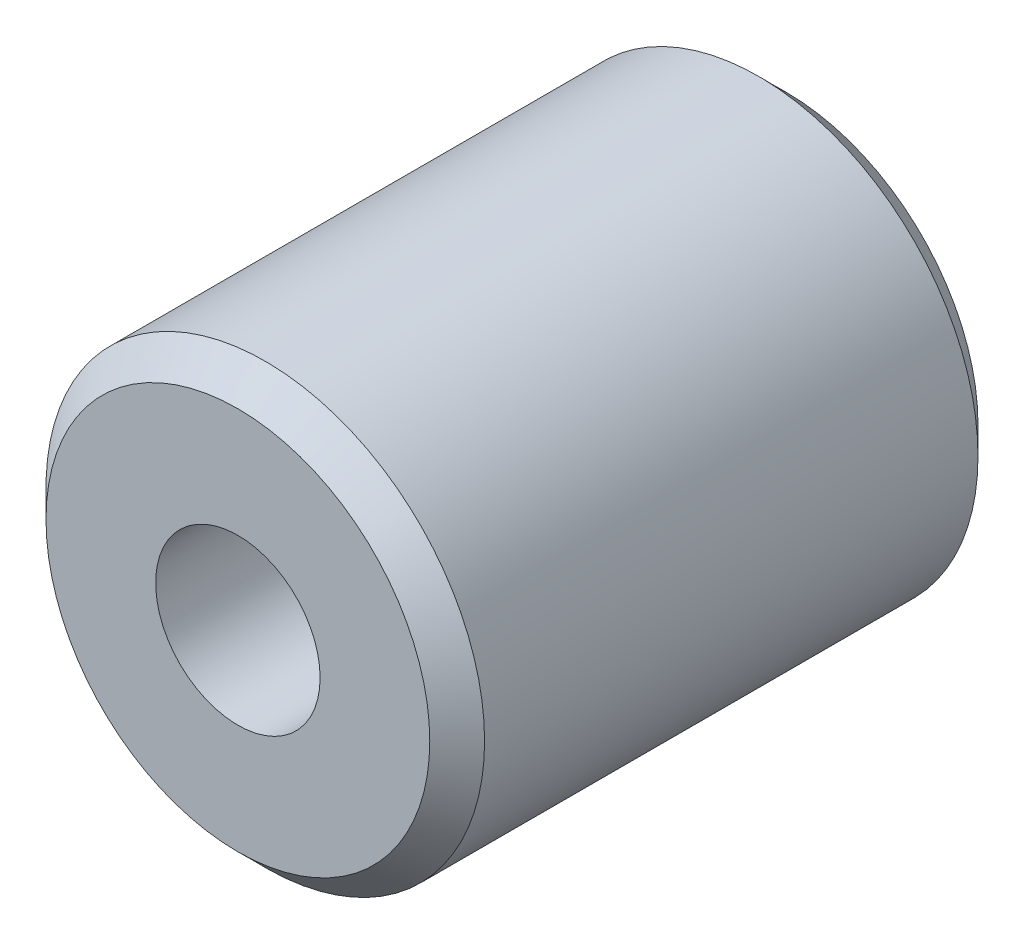
ISO-10303-21;
HEADER;
FILE_DESCRIPTION(('STEP AP214'),'2;1');
FILE_NAME('part.step','',(''),(''),'','','');
FILE_SCHEMA(('AUTOMOTIVE_DESIGN { 1 0 10303 214 1 1 1 1 }'));
ENDSEC;
DATA;
#1=APPLICATION_CONTEXT('core data for automotive mechanical design processes');
#2=APPLICATION_PROTOCOL_DEFINITION('international standard','automotive_design',2000,#1);
#3=PRODUCT_CONTEXT('',#1,'mechanical');
#4=PRODUCT('Part','Part','',(#3));
#5=PRODUCT_RELATED_PRODUCT_CATEGORY('part','',(#4));
#6=PRODUCT_DEFINITION_FORMATION('','',#4);
#7=PRODUCT_DEFINITION_CONTEXT('part definition',#1,'design');
#8=PRODUCT_DEFINITION('design','',#6,#7);
#9=PRODUCT_DEFINITION_SHAPE('','',#8);
#10=(LENGTH_UNIT() NAMED_UNIT(*) SI_UNIT(.MILLI.,.METRE.));
#11=(NAMED_UNIT(*) PLANE_ANGLE_UNIT() SI_UNIT($,.RADIAN.));
#12=(NAMED_UNIT(*) SI_UNIT($,.STERADIAN.) SOLID_ANGLE_UNIT());
#13=UNCERTAINTY_MEASURE_WITH_UNIT(LENGTH_MEASURE(1.E-05),#10,'distance_accuracy_value','');
#14=(GEOMETRIC_REPRESENTATION_CONTEXT(3) GLOBAL_UNCERTAINTY_ASSIGNED_CONTEXT((#13)) GLOBAL_UNIT_ASSIGNED_CONTEXT((#10,
#11,#12)) REPRESENTATION_CONTEXT('',''));
#15=CARTESIAN_POINT('',(0.,0.,0.));
#16=DIRECTION('',(0.,0.,1.));
#17=DIRECTION('',(1.,0.,0.));
#18=AXIS2_PLACEMENT_3D('',#15,#16,#17);
#19=CARTESIAN_POINT('',(0.,0.,10.));
#20=DIRECTION('',(0.,0.,-1.));
#21=DIRECTION('',(-1.,0.,0.));
#22=AXIS2_PLACEMENT_3D('',#19,#20,#21);
#23=CYLINDRICAL_SURFACE('',#22,4.);
#24=CARTESIAN_POINT('',(0.,0.,9.5));
#25=DIRECTION('',(0.,0.,1.));
#26=DIRECTION('',(1.,0.,0.));
#27=AXIS2_PLACEMENT_3D('',#24,#25,#26);
#28=CIRCLE('',#27,4.);
#29=CARTESIAN_POINT('',(4.,0.,9.5));
#30=VERTEX_POINT('',#29);
#31=EDGE_CURVE('E37',#30,#30,#28,.F.);
#32=ORIENTED_EDGE('',*,*,#31,.T.);
#33=EDGE_LOOP('',(#32));
#34=FACE_BOUND('',#33,.T.);
#35=CARTESIAN_POINT('',(0.,0.,0.500000000000009));
#36=DIRECTION('',(0.,0.,1.));
#37=DIRECTION('',(1.,0.,0.));
#38=AXIS2_PLACEMENT_3D('',#35,#36,#37);
#39=CIRCLE('',#38,4.);
#40=CARTESIAN_POINT('',(4.,0.,0.500000000000009));
#41=VERTEX_POINT('',#40);
#42=EDGE_CURVE('E144',#41,#41,#39,.T.);
#43=ORIENTED_EDGE('',*,*,#42,.T.);
#44=EDGE_LOOP('',(#43));
#45=FACE_BOUND('',#44,.T.);
#46=ADVANCED_FACE('F29',(#34,#45),#23,.T.);
#47=CARTESIAN_POINT('',(0.,0.,10.));
#48=DIRECTION('',(0.,0.,1.));
#49=DIRECTION('',(1.,0.,0.));
#50=AXIS2_PLACEMENT_3D('',#47,#48,#49);
#51=PLANE('',#50);
#52=CARTESIAN_POINT('',(0.,0.,10.));
#53=DIRECTION('',(0.,0.,1.));
#54=DIRECTION('',(1.,0.,0.));
#55=AXIS2_PLACEMENT_3D('',#52,#53,#54);
#56=CIRCLE('',#55,1.5);
#57=CARTESIAN_POINT('',(1.5,0.,10.));
#58=VERTEX_POINT('',#57);
#59=EDGE_CURVE('E138',#58,#58,#56,.T.);
#60=ORIENTED_EDGE('',*,*,#59,.F.);
#61=EDGE_LOOP('',(#60));
#62=FACE_BOUND('',#61,.T.);
#63=CARTESIAN_POINT('',(0.,0.,10.));
#64=DIRECTION('',(0.,0.,1.));
#65=DIRECTION('',(1.,0.,0.));
#66=AXIS2_PLACEMENT_3D('',#63,#64,#65);
#67=CIRCLE('',#66,3.49999999999999);
#68=CARTESIAN_POINT('',(3.49999999999999,0.,10.));
#69=VERTEX_POINT('',#68);
#70=EDGE_CURVE('E141',#69,#69,#67,.T.);
#71=ORIENTED_EDGE('',*,*,#70,.T.);
#72=EDGE_LOOP('',(#71));
#73=FACE_BOUND('',#72,.T.);
#74=ADVANCED_FACE('F159',(#62,#73),#51,.T.);
#75=CARTESIAN_POINT('',(0.,0.,0.));
#76=DIRECTION('',(0.,0.,1.));
#77=DIRECTION('',(1.,0.,0.));
#78=AXIS2_PLACEMENT_3D('',#75,#76,#77);
#79=PLANE('',#78);
#80=DIRECTION('',(1.,0.,0.));
#81=VECTOR('',#80,1.);
#82=CARTESIAN_POINT('',(-1.58113883008418,2.73861278752583,0.));
#83=LINE('',#82,#81);
#84=CARTESIAN_POINT('',(-1.58113883008418,2.73861278752583,0.));
#85=VERTEX_POINT('',#84);
#86=CARTESIAN_POINT('',(1.58113883008418,2.73861278752583,0.));
#87=VERTEX_POINT('',#86);
#88=EDGE_CURVE('E98',#85,#87,#83,.T.);
#89=ORIENTED_EDGE('',*,*,#88,.F.);
#90=DIRECTION('',(0.500000000000001,0.866025403784438,0.));
#91=VECTOR('',#90,1.);
#92=CARTESIAN_POINT('',(-1.58113883008418,2.73861278752583,0.));
#93=LINE('',#92,#91);
#94=CARTESIAN_POINT('',(-3.16227766016838,0.,0.));
#95=VERTEX_POINT('',#94);
#96=EDGE_CURVE('E44',#95,#85,#93,.T.);
#97=ORIENTED_EDGE('',*,*,#96,.F.);
#98=DIRECTION('',(-0.500000000000001,0.866025403784438,0.));
#99=VECTOR('',#98,1.);
#100=CARTESIAN_POINT('',(-3.16227766016838,0.,0.));
#101=LINE('',#100,#99);
#102=CARTESIAN_POINT('',(-1.58113883008418,-2.73861278752584,0.));
#103=VERTEX_POINT('',#102);
#104=EDGE_CURVE('E114',#103,#95,#101,.T.);
#105=ORIENTED_EDGE('',*,*,#104,.F.);
#106=DIRECTION('',(-1.,0.,0.));
#107=VECTOR('',#106,1.);
#108=CARTESIAN_POINT('',(-1.58113883008418,-2.73861278752584,0.));
#109=LINE('',#108,#107);
#110=CARTESIAN_POINT('',(1.58113883008417,-2.73861278752584,0.));
#111=VERTEX_POINT('',#110);
#112=EDGE_CURVE('E108',#111,#103,#109,.T.);
#113=ORIENTED_EDGE('',*,*,#112,.F.);
#114=DIRECTION('',(-0.500000000000004,-0.866025403784436,0.));
#115=VECTOR('',#114,1.);
#116=CARTESIAN_POINT('',(1.58113883008417,-2.73861278752584,0.));
#117=LINE('',#116,#115);
#118=CARTESIAN_POINT('',(3.16227766016838,0.,0.));
#119=VERTEX_POINT('',#118);
#120=EDGE_CURVE('E106',#119,#111,#117,.T.);
#121=ORIENTED_EDGE('',*,*,#120,.F.);
#122=DIRECTION('',(0.500000000000001,-0.866025403784438,0.));
#123=VECTOR('',#122,1.);
#124=CARTESIAN_POINT('',(3.16227766016838,0.,0.));
#125=LINE('',#124,#123);
#126=EDGE_CURVE('E87',#87,#119,#125,.T.);
#127=ORIENTED_EDGE('',*,*,#126,.F.);
#128=EDGE_LOOP('',(#89,#97,#105,#113,#121,#127));
#129=FACE_BOUND('',#128,.T.);
#130=CARTESIAN_POINT('',(0.,0.,0.));
#131=DIRECTION('',(0.,0.,1.));
#132=DIRECTION('',(1.,0.,0.));
#133=AXIS2_PLACEMENT_3D('',#130,#131,#132);
#134=CIRCLE('',#133,3.5);
#135=CARTESIAN_POINT('',(3.5,0.,0.));
#136=VERTEX_POINT('',#135);
#137=EDGE_CURVE('E11',#136,#136,#134,.F.);
#138=ORIENTED_EDGE('',*,*,#137,.T.);
#139=EDGE_LOOP('',(#138));
#140=FACE_BOUND('',#139,.T.);
#141=ADVANCED_FACE('F102',(#129,#140),#79,.F.);
#142=CARTESIAN_POINT('',(0.,0.,10.));
#143=DIRECTION('',(0.,0.,-1.));
#144=DIRECTION('',(-1.,0.,0.));
#145=AXIS2_PLACEMENT_3D('',#142,#143,#144);
#146=CONICAL_SURFACE('',#145,3.49999999999999,0.785398163397453);
#147=ORIENTED_EDGE('',*,*,#31,.F.);
#148=EDGE_LOOP('',(#147));
#149=FACE_BOUND('',#148,.T.);
#150=ORIENTED_EDGE('',*,*,#70,.F.);
#151=EDGE_LOOP('',(#150));
#152=FACE_BOUND('',#151,.T.);
#153=ADVANCED_FACE('F152',(#149,#152),#146,.T.);
#154=CARTESIAN_POINT('',(0.,0.,0.500000000000009));
#155=DIRECTION('',(0.,0.,1.));
#156=DIRECTION('',(1.,0.,0.));
#157=AXIS2_PLACEMENT_3D('',#154,#155,#156);
#158=CONICAL_SURFACE('',#157,4.,0.785398163397443);
#159=ORIENTED_EDGE('',*,*,#137,.F.);
#160=EDGE_LOOP('',(#159));
#161=FACE_BOUND('',#160,.T.);
#162=ORIENTED_EDGE('',*,*,#42,.F.);
#163=EDGE_LOOP('',(#162));
#164=FACE_BOUND('',#163,.T.);
#165=ADVANCED_FACE('F155',(#161,#164),#158,.T.);
#166=CARTESIAN_POINT('',(0.,0.,0.));
#167=DIRECTION('',(0.,0.,1.));
#168=DIRECTION('',(1.,0.,0.));
#169=AXIS2_PLACEMENT_3D('',#166,#167,#168);
#170=CYLINDRICAL_SURFACE('',#169,1.5);
#171=CARTESIAN_POINT('',(0.,0.,6.));
#172=DIRECTION('',(0.,0.,1.));
#173=DIRECTION('',(1.,0.,0.));
#174=AXIS2_PLACEMENT_3D('',#171,#172,#173);
#175=CIRCLE('',#174,1.5);
#176=CARTESIAN_POINT('',(1.5,0.,6.));
#177=VERTEX_POINT('',#176);
#178=EDGE_CURVE('E32',#177,#177,#175,.F.);
#179=ORIENTED_EDGE('',*,*,#178,.T.);
#180=EDGE_LOOP('',(#179));
#181=FACE_BOUND('',#180,.T.);
#182=ORIENTED_EDGE('',*,*,#59,.T.);
#183=EDGE_LOOP('',(#182));
#184=FACE_BOUND('',#183,.T.);
#185=ADVANCED_FACE('F171',(#181,#184),#170,.F.);
#186=CARTESIAN_POINT('',(-3.16227766016838,0.,6.));
#187=DIRECTION('',(0.,0.,1.));
#188=DIRECTION('',(1.,0.,0.));
#189=AXIS2_PLACEMENT_3D('',#186,#187,#188);
#190=PLANE('',#189);
#191=DIRECTION('',(0.500000000000001,0.866025403784438,0.));
#192=VECTOR('',#191,1.);
#193=CARTESIAN_POINT('',(-1.58113883008418,2.73861278752583,6.));
#194=LINE('',#193,#192);
#195=CARTESIAN_POINT('',(-3.16227766016838,0.,6.));
#196=VERTEX_POINT('',#195);
#197=CARTESIAN_POINT('',(-1.58113883008418,2.73861278752583,6.));
#198=VERTEX_POINT('',#197);
#199=EDGE_CURVE('E116',#196,#198,#194,.T.);
#200=ORIENTED_EDGE('',*,*,#199,.T.);
#201=DIRECTION('',(1.,0.,0.));
#202=VECTOR('',#201,1.);
#203=CARTESIAN_POINT('',(-1.58113883008418,2.73861278752583,6.));
#204=LINE('',#203,#202);
#205=CARTESIAN_POINT('',(1.58113883008418,2.73861278752583,6.));
#206=VERTEX_POINT('',#205);
#207=EDGE_CURVE('E119',#198,#206,#204,.T.);
#208=ORIENTED_EDGE('',*,*,#207,.T.);
#209=DIRECTION('',(0.500000000000001,-0.866025403784438,0.));
#210=VECTOR('',#209,1.);
#211=CARTESIAN_POINT('',(3.16227766016838,0.,6.));
#212=LINE('',#211,#210);
#213=CARTESIAN_POINT('',(3.16227766016838,0.,6.));
#214=VERTEX_POINT('',#213);
#215=EDGE_CURVE('E90',#206,#214,#212,.T.);
#216=ORIENTED_EDGE('',*,*,#215,.T.);
#217=DIRECTION('',(-0.500000000000004,-0.866025403784436,0.));
#218=VECTOR('',#217,1.);
#219=CARTESIAN_POINT('',(1.58113883008417,-2.73861278752584,6.));
#220=LINE('',#219,#218);
#221=CARTESIAN_POINT('',(1.58113883008417,-2.73861278752584,6.));
#222=VERTEX_POINT('',#221);
#223=EDGE_CURVE('E122',#214,#222,#220,.T.);
#224=ORIENTED_EDGE('',*,*,#223,.T.);
#225=DIRECTION('',(-1.,0.,0.));
#226=VECTOR('',#225,1.);
#227=CARTESIAN_POINT('',(-1.58113883008418,-2.73861278752584,6.));
#228=LINE('',#227,#226);
#229=CARTESIAN_POINT('',(-1.58113883008418,-2.73861278752584,6.));
#230=VERTEX_POINT('',#229);
#231=EDGE_CURVE('E125',#222,#230,#228,.T.);
#232=ORIENTED_EDGE('',*,*,#231,.T.);
#233=DIRECTION('',(-0.500000000000001,0.866025403784438,0.));
#234=VECTOR('',#233,1.);
#235=CARTESIAN_POINT('',(-3.16227766016838,0.,6.));
#236=LINE('',#235,#234);
#237=EDGE_CURVE('E128',#230,#196,#236,.T.);
#238=ORIENTED_EDGE('',*,*,#237,.T.);
#239=EDGE_LOOP('',(#200,#208,#216,#224,#232,#238));
#240=FACE_BOUND('',#239,.T.);
#241=ORIENTED_EDGE('',*,*,#178,.F.);
#242=EDGE_LOOP('',(#241));
#243=FACE_BOUND('',#242,.T.);
#244=ADVANCED_FACE('F175',(#240,#243),#190,.F.);
#245=CARTESIAN_POINT('',(-1.58113883008418,2.73861278752583,6.));
#246=DIRECTION('',(-0.866025403784438,0.500000000000001,0.));
#247=DIRECTION('',(-0.500000000000001,-0.866025403784438,0.));
#248=AXIS2_PLACEMENT_3D('',#245,#246,#247);
#249=PLANE('',#248);
#250=ORIENTED_EDGE('',*,*,#96,.T.);
#251=DIRECTION('',(0.,0.,-1.));
#252=VECTOR('',#251,1.);
#253=CARTESIAN_POINT('',(-1.58113883008418,2.73861278752583,6.));
#254=LINE('',#253,#252);
#255=EDGE_CURVE('E95',#198,#85,#254,.T.);
#256=ORIENTED_EDGE('',*,*,#255,.F.);
#257=ORIENTED_EDGE('',*,*,#199,.F.);
#258=DIRECTION('',(0.,0.,-1.));
#259=VECTOR('',#258,1.);
#260=CARTESIAN_POINT('',(-3.16227766016838,0.,6.));
#261=LINE('',#260,#259);
#262=EDGE_CURVE('E51',#196,#95,#261,.T.);
#263=ORIENTED_EDGE('',*,*,#262,.T.);
#264=EDGE_LOOP('',(#250,#256,#257,#263));
#265=FACE_BOUND('',#264,.T.);
#266=ADVANCED_FACE('F177',(#265),#249,.F.);
#267=CARTESIAN_POINT('',(-3.16227766016838,0.,6.));
#268=DIRECTION('',(-0.866025403784438,-0.500000000000001,0.));
#269=DIRECTION('',(0.500000000000001,-0.866025403784438,0.));
#270=AXIS2_PLACEMENT_3D('',#267,#268,#269);
#271=PLANE('',#270);
#272=ORIENTED_EDGE('',*,*,#104,.T.);
#273=ORIENTED_EDGE('',*,*,#262,.F.);
#274=ORIENTED_EDGE('',*,*,#237,.F.);
#275=DIRECTION('',(0.,0.,-1.));
#276=VECTOR('',#275,1.);
#277=CARTESIAN_POINT('',(-1.58113883008418,-2.73861278752584,6.));
#278=LINE('',#277,#276);
#279=EDGE_CURVE('E132',#230,#103,#278,.T.);
#280=ORIENTED_EDGE('',*,*,#279,.T.);
#281=EDGE_LOOP('',(#272,#273,#274,#280));
#282=FACE_BOUND('',#281,.T.);
#283=ADVANCED_FACE('F180',(#282),#271,.F.);
#284=CARTESIAN_POINT('',(-1.58113883008418,-2.73861278752584,6.));
#285=DIRECTION('',(0.,-1.,0.));
#286=DIRECTION('',(1.,0.,0.));
#287=AXIS2_PLACEMENT_3D('',#284,#285,#286);
#288=PLANE('',#287);
#289=ORIENTED_EDGE('',*,*,#112,.T.);
#290=ORIENTED_EDGE('',*,*,#279,.F.);
#291=ORIENTED_EDGE('',*,*,#231,.F.);
#292=DIRECTION('',(0.,0.,-1.));
#293=VECTOR('',#292,1.);
#294=CARTESIAN_POINT('',(1.58113883008417,-2.73861278752584,6.));
#295=LINE('',#294,#293);
#296=EDGE_CURVE('E134',#222,#111,#295,.T.);
#297=ORIENTED_EDGE('',*,*,#296,.T.);
#298=EDGE_LOOP('',(#289,#290,#291,#297));
#299=FACE_BOUND('',#298,.T.);
#300=ADVANCED_FACE('F188',(#299),#288,.F.);
#301=CARTESIAN_POINT('',(1.58113883008417,-2.73861278752584,6.));
#302=DIRECTION('',(0.866025403784436,-0.500000000000004,0.));
#303=DIRECTION('',(0.500000000000004,0.866025403784437,0.));
#304=AXIS2_PLACEMENT_3D('',#301,#302,#303);
#305=PLANE('',#304);
#306=ORIENTED_EDGE('',*,*,#120,.T.);
#307=ORIENTED_EDGE('',*,*,#296,.F.);
#308=ORIENTED_EDGE('',*,*,#223,.F.);
#309=DIRECTION('',(0.,0.,-1.));
#310=VECTOR('',#309,1.);
#311=CARTESIAN_POINT('',(3.16227766016838,0.,6.));
#312=LINE('',#311,#310);
#313=EDGE_CURVE('E94',#214,#119,#312,.T.);
#314=ORIENTED_EDGE('',*,*,#313,.T.);
#315=EDGE_LOOP('',(#306,#307,#308,#314));
#316=FACE_BOUND('',#315,.T.);
#317=ADVANCED_FACE('F185',(#316),#305,.F.);
#318=CARTESIAN_POINT('',(3.16227766016838,0.,6.));
#319=DIRECTION('',(0.866025403784438,0.500000000000001,0.));
#320=DIRECTION('',(-0.500000000000001,0.866025403784438,0.));
#321=AXIS2_PLACEMENT_3D('',#318,#319,#320);
#322=PLANE('',#321);
#323=ORIENTED_EDGE('',*,*,#126,.T.);
#324=ORIENTED_EDGE('',*,*,#313,.F.);
#325=ORIENTED_EDGE('',*,*,#215,.F.);
#326=DIRECTION('',(0.,0.,-1.));
#327=VECTOR('',#326,1.);
#328=CARTESIAN_POINT('',(1.58113883008418,2.73861278752583,6.));
#329=LINE('',#328,#327);
#330=EDGE_CURVE('E83',#206,#87,#329,.T.);
#331=ORIENTED_EDGE('',*,*,#330,.T.);
#332=EDGE_LOOP('',(#323,#324,#325,#331));
#333=FACE_BOUND('',#332,.T.);
#334=ADVANCED_FACE('F85',(#333),#322,.F.);
#335=CARTESIAN_POINT('',(-1.58113883008418,2.73861278752583,6.));
#336=DIRECTION('',(0.,1.,0.));
#337=DIRECTION('',(0.,0.,1.));
#338=AXIS2_PLACEMENT_3D('',#335,#336,#337);
#339=PLANE('',#338);
#340=ORIENTED_EDGE('',*,*,#88,.T.);
#341=ORIENTED_EDGE('',*,*,#330,.F.);
#342=ORIENTED_EDGE('',*,*,#207,.F.);
#343=ORIENTED_EDGE('',*,*,#255,.T.);
#344=EDGE_LOOP('',(#340,#341,#342,#343));
#345=FACE_BOUND('',#344,.T.);
#346=ADVANCED_FACE('F99',(#345),#339,.F.);
#347=CLOSED_SHELL('',(#46,#74,#141,#153,#165,#185,#244,#266,#283,#300,#317,#334,#346));
#348=MANIFOLD_SOLID_BREP('B2',#347);
#349=ADVANCED_BREP_SHAPE_REPRESENTATION('',(#18,#348),#14);
#350=SHAPE_DEFINITION_REPRESENTATION(#9,#349);
ENDSEC;
END-ISO-10303-21;
